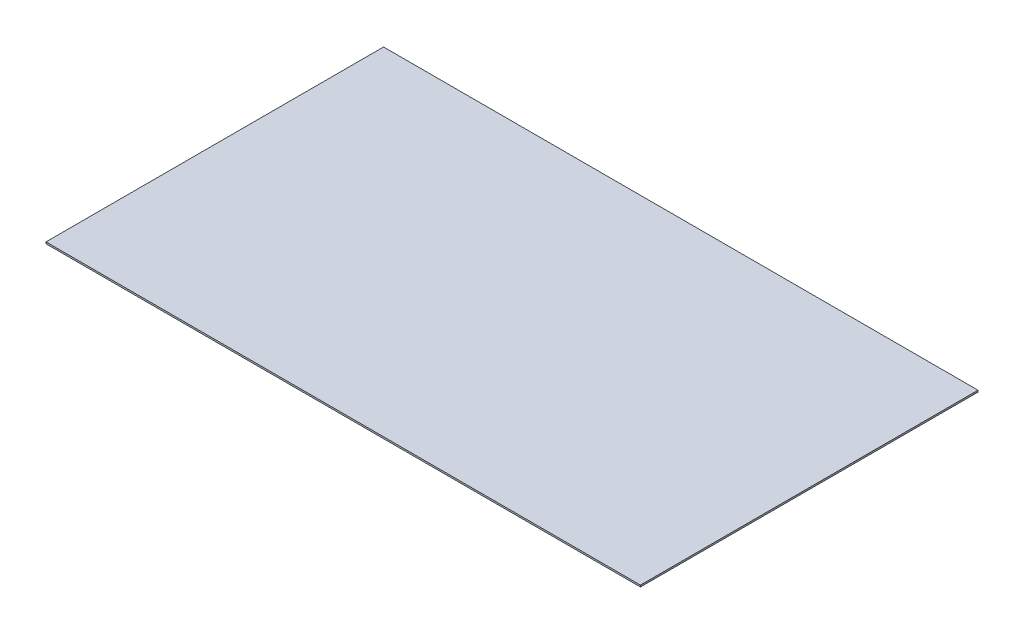
ISO-10303-21;
HEADER;
FILE_DESCRIPTION(('STEP AP214'),'2;1');
FILE_NAME('part.step','',(''),(''),'','','');
FILE_SCHEMA(('AUTOMOTIVE_DESIGN { 1 0 10303 214 1 1 1 1 }'));
ENDSEC;
DATA;
#1=APPLICATION_CONTEXT('core data for automotive mechanical design processes');
#2=APPLICATION_PROTOCOL_DEFINITION('international standard','automotive_design',2000,#1);
#3=PRODUCT_CONTEXT('',#1,'mechanical');
#4=PRODUCT('Part','Part','',(#3));
#5=PRODUCT_RELATED_PRODUCT_CATEGORY('part','',(#4));
#6=PRODUCT_DEFINITION_FORMATION('','',#4);
#7=PRODUCT_DEFINITION_CONTEXT('part definition',#1,'design');
#8=PRODUCT_DEFINITION('design','',#6,#7);
#9=PRODUCT_DEFINITION_SHAPE('','',#8);
#10=(LENGTH_UNIT() NAMED_UNIT(*) SI_UNIT(.MILLI.,.METRE.));
#11=(NAMED_UNIT(*) PLANE_ANGLE_UNIT() SI_UNIT($,.RADIAN.));
#12=(NAMED_UNIT(*) SI_UNIT($,.STERADIAN.) SOLID_ANGLE_UNIT());
#13=UNCERTAINTY_MEASURE_WITH_UNIT(LENGTH_MEASURE(1.E-05),#10,'distance_accuracy_value','');
#14=(GEOMETRIC_REPRESENTATION_CONTEXT(3) GLOBAL_UNCERTAINTY_ASSIGNED_CONTEXT((#13)) GLOBAL_UNIT_ASSIGNED_CONTEXT((#10,
#11,#12)) REPRESENTATION_CONTEXT('',''));
#15=CARTESIAN_POINT('',(0.,0.,0.));
#16=DIRECTION('',(0.,0.,1.));
#17=DIRECTION('',(1.,0.,0.));
#18=AXIS2_PLACEMENT_3D('',#15,#16,#17);
#19=CARTESIAN_POINT('',(-281.15,1.5875,159.65));
#20=DIRECTION('',(1.,0.,0.));
#21=DIRECTION('',(0.,0.,-1.));
#22=AXIS2_PLACEMENT_3D('',#19,#20,#21);
#23=PLANE('',#22);
#24=DIRECTION('',(0.,0.,1.));
#25=VECTOR('',#24,1.);
#26=CARTESIAN_POINT('',(-281.15,0.,159.65));
#27=LINE('',#26,#25);
#28=CARTESIAN_POINT('',(-281.15,0.,-159.65));
#29=VERTEX_POINT('',#28);
#30=CARTESIAN_POINT('',(-281.15,0.,159.65));
#31=VERTEX_POINT('',#30);
#32=EDGE_CURVE('E96',#29,#31,#27,.T.);
#33=ORIENTED_EDGE('',*,*,#32,.T.);
#34=DIRECTION('',(0.,-1.,0.));
#35=VECTOR('',#34,1.);
#36=CARTESIAN_POINT('',(-281.15,1.5875,159.65));
#37=LINE('',#36,#35);
#38=CARTESIAN_POINT('',(-281.15,1.5875,159.65));
#39=VERTEX_POINT('',#38);
#40=EDGE_CURVE('E11',#39,#31,#37,.T.);
#41=ORIENTED_EDGE('',*,*,#40,.F.);
#42=DIRECTION('',(0.,0.,1.));
#43=VECTOR('',#42,1.);
#44=CARTESIAN_POINT('',(-281.15,1.5875,159.65));
#45=LINE('',#44,#43);
#46=CARTESIAN_POINT('',(-281.15,1.5875,-159.65));
#47=VERTEX_POINT('',#46);
#48=EDGE_CURVE('E84',#47,#39,#45,.T.);
#49=ORIENTED_EDGE('',*,*,#48,.F.);
#50=DIRECTION('',(0.,-1.,0.));
#51=VECTOR('',#50,1.);
#52=CARTESIAN_POINT('',(-281.15,1.5875,-159.65));
#53=LINE('',#52,#51);
#54=EDGE_CURVE('E92',#47,#29,#53,.T.);
#55=ORIENTED_EDGE('',*,*,#54,.T.);
#56=EDGE_LOOP('',(#33,#41,#49,#55));
#57=FACE_BOUND('',#56,.T.);
#58=ADVANCED_FACE('F33',(#57),#23,.F.);
#59=CARTESIAN_POINT('',(281.15,1.5875,159.65));
#60=DIRECTION('',(0.,0.,-1.));
#61=DIRECTION('',(-1.,0.,0.));
#62=AXIS2_PLACEMENT_3D('',#59,#60,#61);
#63=PLANE('',#62);
#64=DIRECTION('',(1.,0.,0.));
#65=VECTOR('',#64,1.);
#66=CARTESIAN_POINT('',(281.15,0.,159.65));
#67=LINE('',#66,#65);
#68=CARTESIAN_POINT('',(281.15,0.,159.65));
#69=VERTEX_POINT('',#68);
#70=EDGE_CURVE('E88',#31,#69,#67,.T.);
#71=ORIENTED_EDGE('',*,*,#70,.T.);
#72=DIRECTION('',(0.,-1.,0.));
#73=VECTOR('',#72,1.);
#74=CARTESIAN_POINT('',(281.15,1.5875,159.65));
#75=LINE('',#74,#73);
#76=CARTESIAN_POINT('',(281.15,1.5875,159.65));
#77=VERTEX_POINT('',#76);
#78=EDGE_CURVE('E41',#77,#69,#75,.T.);
#79=ORIENTED_EDGE('',*,*,#78,.F.);
#80=DIRECTION('',(1.,0.,0.));
#81=VECTOR('',#80,1.);
#82=CARTESIAN_POINT('',(281.15,1.5875,159.65));
#83=LINE('',#82,#81);
#84=EDGE_CURVE('E79',#39,#77,#83,.T.);
#85=ORIENTED_EDGE('',*,*,#84,.F.);
#86=ORIENTED_EDGE('',*,*,#40,.T.);
#87=EDGE_LOOP('',(#71,#79,#85,#86));
#88=FACE_BOUND('',#87,.T.);
#89=ADVANCED_FACE('F87',(#88),#63,.F.);
#90=CARTESIAN_POINT('',(281.15,1.5875,159.65));
#91=DIRECTION('',(-1.,0.,0.));
#92=DIRECTION('',(0.,0.,1.));
#93=AXIS2_PLACEMENT_3D('',#90,#91,#92);
#94=PLANE('',#93);
#95=DIRECTION('',(0.,0.,-1.));
#96=VECTOR('',#95,1.);
#97=CARTESIAN_POINT('',(281.15,0.,159.65));
#98=LINE('',#97,#96);
#99=CARTESIAN_POINT('',(281.15,0.,-159.65));
#100=VERTEX_POINT('',#99);
#101=EDGE_CURVE('E66',#69,#100,#98,.T.);
#102=ORIENTED_EDGE('',*,*,#101,.T.);
#103=DIRECTION('',(0.,-1.,0.));
#104=VECTOR('',#103,1.);
#105=CARTESIAN_POINT('',(281.15,1.5875,-159.65));
#106=LINE('',#105,#104);
#107=CARTESIAN_POINT('',(281.15,1.5875,-159.65));
#108=VERTEX_POINT('',#107);
#109=EDGE_CURVE('E89',#108,#100,#106,.T.);
#110=ORIENTED_EDGE('',*,*,#109,.F.);
#111=DIRECTION('',(0.,0.,-1.));
#112=VECTOR('',#111,1.);
#113=CARTESIAN_POINT('',(281.15,1.5875,159.65));
#114=LINE('',#113,#112);
#115=EDGE_CURVE('E82',#77,#108,#114,.T.);
#116=ORIENTED_EDGE('',*,*,#115,.F.);
#117=ORIENTED_EDGE('',*,*,#78,.T.);
#118=EDGE_LOOP('',(#102,#110,#116,#117));
#119=FACE_BOUND('',#118,.T.);
#120=ADVANCED_FACE('F90',(#119),#94,.F.);
#121=CARTESIAN_POINT('',(281.15,1.5875,-159.65));
#122=DIRECTION('',(0.,0.,1.));
#123=DIRECTION('',(1.,0.,0.));
#124=AXIS2_PLACEMENT_3D('',#121,#122,#123);
#125=PLANE('',#124);
#126=DIRECTION('',(-1.,0.,0.));
#127=VECTOR('',#126,1.);
#128=CARTESIAN_POINT('',(281.15,0.,-159.65));
#129=LINE('',#128,#127);
#130=EDGE_CURVE('E72',#100,#29,#129,.T.);
#131=ORIENTED_EDGE('',*,*,#130,.T.);
#132=ORIENTED_EDGE('',*,*,#54,.F.);
#133=DIRECTION('',(-1.,0.,0.));
#134=VECTOR('',#133,1.);
#135=CARTESIAN_POINT('',(281.15,1.5875,-159.65));
#136=LINE('',#135,#134);
#137=EDGE_CURVE('E49',#108,#47,#136,.T.);
#138=ORIENTED_EDGE('',*,*,#137,.F.);
#139=ORIENTED_EDGE('',*,*,#109,.T.);
#140=EDGE_LOOP('',(#131,#132,#138,#139));
#141=FACE_BOUND('',#140,.T.);
#142=ADVANCED_FACE('F103',(#141),#125,.F.);
#143=CARTESIAN_POINT('',(0.,1.5875,0.));
#144=DIRECTION('',(0.,1.,0.));
#145=DIRECTION('',(0.,0.,1.));
#146=AXIS2_PLACEMENT_3D('',#143,#144,#145);
#147=PLANE('',#146);
#148=ORIENTED_EDGE('',*,*,#48,.T.);
#149=ORIENTED_EDGE('',*,*,#84,.T.);
#150=ORIENTED_EDGE('',*,*,#115,.T.);
#151=ORIENTED_EDGE('',*,*,#137,.T.);
#152=EDGE_LOOP('',(#148,#149,#150,#151));
#153=FACE_BOUND('',#152,.T.);
#154=ADVANCED_FACE('F80',(#153),#147,.T.);
#155=CARTESIAN_POINT('',(0.,0.,0.));
#156=DIRECTION('',(0.,1.,0.));
#157=DIRECTION('',(0.,0.,1.));
#158=AXIS2_PLACEMENT_3D('',#155,#156,#157);
#159=PLANE('',#158);
#160=ORIENTED_EDGE('',*,*,#32,.F.);
#161=ORIENTED_EDGE('',*,*,#130,.F.);
#162=ORIENTED_EDGE('',*,*,#101,.F.);
#163=ORIENTED_EDGE('',*,*,#70,.F.);
#164=EDGE_LOOP('',(#160,#161,#162,#163));
#165=FACE_BOUND('',#164,.T.);
#166=ADVANCED_FACE('F106',(#165),#159,.F.);
#167=CLOSED_SHELL('',(#58,#89,#120,#142,#154,#166));
#168=MANIFOLD_SOLID_BREP('B2',#167);
#169=ADVANCED_BREP_SHAPE_REPRESENTATION('',(#18,#168),#14);
#170=SHAPE_DEFINITION_REPRESENTATION(#9,#169);
ENDSEC;
END-ISO-10303-21;
